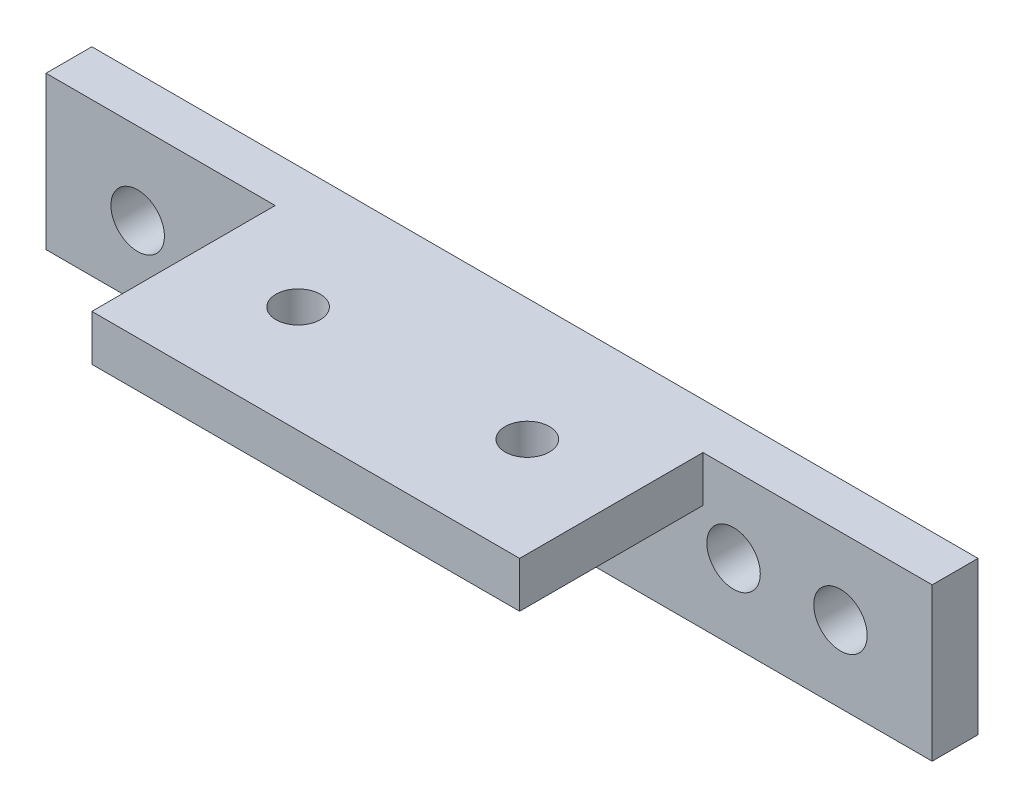
ISO-10303-21;
HEADER;
FILE_DESCRIPTION(('STEP AP214'),'2;1');
FILE_NAME('part.step','',(''),(''),'','','');
FILE_SCHEMA(('AUTOMOTIVE_DESIGN { 1 0 10303 214 1 1 1 1 }'));
ENDSEC;
DATA;
#1=APPLICATION_CONTEXT('core data for automotive mechanical design processes');
#2=APPLICATION_PROTOCOL_DEFINITION('international standard','automotive_design',2000,#1);
#3=PRODUCT_CONTEXT('',#1,'mechanical');
#4=PRODUCT('Part','Part','',(#3));
#5=PRODUCT_RELATED_PRODUCT_CATEGORY('part','',(#4));
#6=PRODUCT_DEFINITION_FORMATION('','',#4);
#7=PRODUCT_DEFINITION_CONTEXT('part definition',#1,'design');
#8=PRODUCT_DEFINITION('design','',#6,#7);
#9=PRODUCT_DEFINITION_SHAPE('','',#8);
#10=(LENGTH_UNIT() NAMED_UNIT(*) SI_UNIT(.MILLI.,.METRE.));
#11=(NAMED_UNIT(*) PLANE_ANGLE_UNIT() SI_UNIT($,.RADIAN.));
#12=(NAMED_UNIT(*) SI_UNIT($,.STERADIAN.) SOLID_ANGLE_UNIT());
#13=UNCERTAINTY_MEASURE_WITH_UNIT(LENGTH_MEASURE(1.E-05),#10,'distance_accuracy_value','');
#14=(GEOMETRIC_REPRESENTATION_CONTEXT(3) GLOBAL_UNCERTAINTY_ASSIGNED_CONTEXT((#13)) GLOBAL_UNIT_ASSIGNED_CONTEXT((#10,
#11,#12)) REPRESENTATION_CONTEXT('',''));
#15=CARTESIAN_POINT('',(0.,0.,0.));
#16=DIRECTION('',(0.,0.,1.));
#17=DIRECTION('',(1.,0.,0.));
#18=AXIS2_PLACEMENT_3D('',#15,#16,#17);
#19=CARTESIAN_POINT('',(0.,3.,0.));
#20=DIRECTION('',(0.,1.,0.));
#21=DIRECTION('',(0.,0.,1.));
#22=AXIS2_PLACEMENT_3D('',#19,#20,#21);
#23=PLANE('',#22);
#24=CARTESIAN_POINT('',(6.5,3.,5.));
#25=DIRECTION('',(0.,1.,0.));
#26=DIRECTION('',(0.,0.,1.));
#27=AXIS2_PLACEMENT_3D('',#24,#25,#26);
#28=CIRCLE('',#27,1.45);
#29=CARTESIAN_POINT('',(6.5,3.,6.45));
#30=VERTEX_POINT('',#29);
#31=EDGE_CURVE('E157',#30,#30,#28,.T.);
#32=ORIENTED_EDGE('',*,*,#31,.F.);
#33=EDGE_LOOP('',(#32));
#34=FACE_BOUND('',#33,.T.);
#35=DIRECTION('',(0.,0.,1.));
#36=VECTOR('',#35,1.);
#37=CARTESIAN_POINT('',(0.,3.,0.));
#38=LINE('',#37,#36);
#39=CARTESIAN_POINT('',(0.,3.,0.));
#40=VERTEX_POINT('',#39);
#41=CARTESIAN_POINT('',(0.,3.,12.));
#42=VERTEX_POINT('',#41);
#43=EDGE_CURVE('E50',#40,#42,#38,.T.);
#44=ORIENTED_EDGE('',*,*,#43,.T.);
#45=DIRECTION('',(1.,0.,0.));
#46=VECTOR('',#45,1.);
#47=CARTESIAN_POINT('',(0.,3.,12.));
#48=LINE('',#47,#46);
#49=CARTESIAN_POINT('',(28.,3.,12.));
#50=VERTEX_POINT('',#49);
#51=EDGE_CURVE('E73',#42,#50,#48,.T.);
#52=ORIENTED_EDGE('',*,*,#51,.T.);
#53=DIRECTION('',(0.,0.,-1.));
#54=VECTOR('',#53,1.);
#55=CARTESIAN_POINT('',(28.,3.,0.));
#56=LINE('',#55,#54);
#57=CARTESIAN_POINT('',(28.,3.,0.));
#58=VERTEX_POINT('',#57);
#59=EDGE_CURVE('E166',#50,#58,#56,.T.);
#60=ORIENTED_EDGE('',*,*,#59,.T.);
#61=DIRECTION('',(1.,0.,0.));
#62=VECTOR('',#61,1.);
#63=CARTESIAN_POINT('',(43.,3.,0.));
#64=LINE('',#63,#62);
#65=CARTESIAN_POINT('',(43.,3.,0.));
#66=VERTEX_POINT('',#65);
#67=EDGE_CURVE('E132',#58,#66,#64,.T.);
#68=ORIENTED_EDGE('',*,*,#67,.T.);
#69=DIRECTION('',(0.,0.,-1.));
#70=VECTOR('',#69,1.);
#71=CARTESIAN_POINT('',(43.,3.,0.));
#72=LINE('',#71,#70);
#73=CARTESIAN_POINT('',(43.,3.,-3.00000000000001));
#74=VERTEX_POINT('',#73);
#75=EDGE_CURVE('E140',#66,#74,#72,.T.);
#76=ORIENTED_EDGE('',*,*,#75,.T.);
#77=DIRECTION('',(-1.,0.,0.));
#78=VECTOR('',#77,1.);
#79=CARTESIAN_POINT('',(43.,3.,-3.00000000000001));
#80=LINE('',#79,#78);
#81=CARTESIAN_POINT('',(-15.,3.,-3.));
#82=VERTEX_POINT('',#81);
#83=EDGE_CURVE('E108',#74,#82,#80,.T.);
#84=ORIENTED_EDGE('',*,*,#83,.T.);
#85=DIRECTION('',(0.,0.,1.));
#86=VECTOR('',#85,1.);
#87=CARTESIAN_POINT('',(-15.,3.,0.));
#88=LINE('',#87,#86);
#89=CARTESIAN_POINT('',(-15.,3.,0.));
#90=VERTEX_POINT('',#89);
#91=EDGE_CURVE('E143',#82,#90,#88,.T.);
#92=ORIENTED_EDGE('',*,*,#91,.T.);
#93=EDGE_CURVE('E129',#90,#40,#64,.T.);
#94=ORIENTED_EDGE('',*,*,#93,.T.);
#95=EDGE_LOOP('',(#44,#52,#60,#68,#76,#84,#92,#94));
#96=FACE_BOUND('',#95,.T.);
#97=CARTESIAN_POINT('',(21.5,3.,5.));
#98=DIRECTION('',(0.,1.,0.));
#99=DIRECTION('',(0.,0.,1.));
#100=AXIS2_PLACEMENT_3D('',#97,#98,#99);
#101=CIRCLE('',#100,1.45);
#102=CARTESIAN_POINT('',(21.5,3.,6.45));
#103=VERTEX_POINT('',#102);
#104=EDGE_CURVE('E151',#103,#103,#101,.T.);
#105=ORIENTED_EDGE('',*,*,#104,.F.);
#106=EDGE_LOOP('',(#105));
#107=FACE_BOUND('',#106,.T.);
#108=ADVANCED_FACE('F33',(#34,#96,#107),#23,.T.);
#109=CARTESIAN_POINT('',(0.,0.,0.));
#110=DIRECTION('',(0.,1.,0.));
#111=DIRECTION('',(0.,0.,1.));
#112=AXIS2_PLACEMENT_3D('',#109,#110,#111);
#113=PLANE('',#112);
#114=DIRECTION('',(0.,0.,1.));
#115=VECTOR('',#114,1.);
#116=CARTESIAN_POINT('',(0.,0.,0.));
#117=LINE('',#116,#115);
#118=CARTESIAN_POINT('',(0.,0.,0.));
#119=VERTEX_POINT('',#118);
#120=CARTESIAN_POINT('',(0.,0.,12.));
#121=VERTEX_POINT('',#120);
#122=EDGE_CURVE('E160',#119,#121,#117,.T.);
#123=ORIENTED_EDGE('',*,*,#122,.F.);
#124=DIRECTION('',(-1.,0.,0.));
#125=VECTOR('',#124,1.);
#126=CARTESIAN_POINT('',(0.,0.,0.));
#127=LINE('',#126,#125);
#128=CARTESIAN_POINT('',(28.,0.,0.));
#129=VERTEX_POINT('',#128);
#130=EDGE_CURVE('E164',#129,#119,#127,.T.);
#131=ORIENTED_EDGE('',*,*,#130,.F.);
#132=DIRECTION('',(0.,0.,-1.));
#133=VECTOR('',#132,1.);
#134=CARTESIAN_POINT('',(28.,0.,0.));
#135=LINE('',#134,#133);
#136=CARTESIAN_POINT('',(28.,0.,12.));
#137=VERTEX_POINT('',#136);
#138=EDGE_CURVE('E170',#137,#129,#135,.T.);
#139=ORIENTED_EDGE('',*,*,#138,.F.);
#140=DIRECTION('',(1.,0.,0.));
#141=VECTOR('',#140,1.);
#142=CARTESIAN_POINT('',(0.,0.,12.));
#143=LINE('',#142,#141);
#144=EDGE_CURVE('E64',#121,#137,#143,.T.);
#145=ORIENTED_EDGE('',*,*,#144,.F.);
#146=EDGE_LOOP('',(#123,#131,#139,#145));
#147=FACE_BOUND('',#146,.T.);
#148=CARTESIAN_POINT('',(6.5,0.,5.));
#149=DIRECTION('',(0.,1.,0.));
#150=DIRECTION('',(0.,0.,1.));
#151=AXIS2_PLACEMENT_3D('',#148,#149,#150);
#152=CIRCLE('',#151,1.45);
#153=CARTESIAN_POINT('',(6.5,0.,6.45));
#154=VERTEX_POINT('',#153);
#155=EDGE_CURVE('E154',#154,#154,#152,.T.);
#156=ORIENTED_EDGE('',*,*,#155,.T.);
#157=EDGE_LOOP('',(#156));
#158=FACE_BOUND('',#157,.T.);
#159=CARTESIAN_POINT('',(21.5,0.,5.));
#160=DIRECTION('',(0.,1.,0.));
#161=DIRECTION('',(0.,0.,1.));
#162=AXIS2_PLACEMENT_3D('',#159,#160,#161);
#163=CIRCLE('',#162,1.45);
#164=CARTESIAN_POINT('',(21.5,0.,6.45));
#165=VERTEX_POINT('',#164);
#166=EDGE_CURVE('E147',#165,#165,#163,.T.);
#167=ORIENTED_EDGE('',*,*,#166,.T.);
#168=EDGE_LOOP('',(#167));
#169=FACE_BOUND('',#168,.T.);
#170=ADVANCED_FACE('F184',(#147,#158,#169),#113,.F.);
#171=CARTESIAN_POINT('',(0.,3.,0.));
#172=DIRECTION('',(1.,0.,0.));
#173=DIRECTION('',(0.,0.,-1.));
#174=AXIS2_PLACEMENT_3D('',#171,#172,#173);
#175=PLANE('',#174);
#176=ORIENTED_EDGE('',*,*,#122,.T.);
#177=DIRECTION('',(0.,-1.,0.));
#178=VECTOR('',#177,1.);
#179=CARTESIAN_POINT('',(0.,3.,12.));
#180=LINE('',#179,#178);
#181=EDGE_CURVE('E11',#42,#121,#180,.T.);
#182=ORIENTED_EDGE('',*,*,#181,.F.);
#183=ORIENTED_EDGE('',*,*,#43,.F.);
#184=DIRECTION('',(0.,-1.,0.));
#185=VECTOR('',#184,1.);
#186=CARTESIAN_POINT('',(0.,3.,0.));
#187=LINE('',#186,#185);
#188=EDGE_CURVE('E68',#40,#119,#187,.T.);
#189=ORIENTED_EDGE('',*,*,#188,.T.);
#190=EDGE_LOOP('',(#176,#182,#183,#189));
#191=FACE_BOUND('',#190,.T.);
#192=ADVANCED_FACE('F35',(#191),#175,.F.);
#193=CARTESIAN_POINT('',(0.,3.,12.));
#194=DIRECTION('',(0.,0.,-1.));
#195=DIRECTION('',(-1.,0.,0.));
#196=AXIS2_PLACEMENT_3D('',#193,#194,#195);
#197=PLANE('',#196);
#198=ORIENTED_EDGE('',*,*,#144,.T.);
#199=DIRECTION('',(0.,-1.,0.));
#200=VECTOR('',#199,1.);
#201=CARTESIAN_POINT('',(28.,3.,12.));
#202=LINE('',#201,#200);
#203=EDGE_CURVE('E42',#50,#137,#202,.T.);
#204=ORIENTED_EDGE('',*,*,#203,.F.);
#205=ORIENTED_EDGE('',*,*,#51,.F.);
#206=ORIENTED_EDGE('',*,*,#181,.T.);
#207=EDGE_LOOP('',(#198,#204,#205,#206));
#208=FACE_BOUND('',#207,.T.);
#209=ADVANCED_FACE('F192',(#208),#197,.F.);
#210=CARTESIAN_POINT('',(28.,3.,0.));
#211=DIRECTION('',(-1.,0.,0.));
#212=DIRECTION('',(0.,0.,1.));
#213=AXIS2_PLACEMENT_3D('',#210,#211,#212);
#214=PLANE('',#213);
#215=ORIENTED_EDGE('',*,*,#138,.T.);
#216=DIRECTION('',(0.,-1.,0.));
#217=VECTOR('',#216,1.);
#218=CARTESIAN_POINT('',(28.,3.,0.));
#219=LINE('',#218,#217);
#220=EDGE_CURVE('E176',#58,#129,#219,.T.);
#221=ORIENTED_EDGE('',*,*,#220,.F.);
#222=ORIENTED_EDGE('',*,*,#59,.F.);
#223=ORIENTED_EDGE('',*,*,#203,.T.);
#224=EDGE_LOOP('',(#215,#221,#222,#223));
#225=FACE_BOUND('',#224,.T.);
#226=ADVANCED_FACE('F181',(#225),#214,.F.);
#227=CARTESIAN_POINT('',(6.5,3.,5.));
#228=DIRECTION('',(0.,-1.,0.));
#229=DIRECTION('',(0.,0.,-1.));
#230=AXIS2_PLACEMENT_3D('',#227,#228,#229);
#231=CYLINDRICAL_SURFACE('',#230,1.45);
#232=ORIENTED_EDGE('',*,*,#31,.T.);
#233=EDGE_LOOP('',(#232));
#234=FACE_BOUND('',#233,.T.);
#235=ORIENTED_EDGE('',*,*,#155,.F.);
#236=EDGE_LOOP('',(#235));
#237=FACE_BOUND('',#236,.T.);
#238=ADVANCED_FACE('F198',(#234,#237),#231,.F.);
#239=CARTESIAN_POINT('',(21.5,3.,5.));
#240=DIRECTION('',(0.,-1.,0.));
#241=DIRECTION('',(0.,0.,-1.));
#242=AXIS2_PLACEMENT_3D('',#239,#240,#241);
#243=CYLINDRICAL_SURFACE('',#242,1.45);
#244=ORIENTED_EDGE('',*,*,#104,.T.);
#245=EDGE_LOOP('',(#244));
#246=FACE_BOUND('',#245,.T.);
#247=ORIENTED_EDGE('',*,*,#166,.F.);
#248=EDGE_LOOP('',(#247));
#249=FACE_BOUND('',#248,.T.);
#250=ADVANCED_FACE('F211',(#246,#249),#243,.F.);
#251=CARTESIAN_POINT('',(43.,-7.,0.));
#252=DIRECTION('',(0.,0.,1.));
#253=DIRECTION('',(1.,0.,0.));
#254=AXIS2_PLACEMENT_3D('',#251,#252,#253);
#255=PLANE('',#254);
#256=CARTESIAN_POINT('',(36.9985952954715,-2.,0.));
#257=DIRECTION('',(0.,0.,1.));
#258=DIRECTION('',(1.,0.,0.));
#259=AXIS2_PLACEMENT_3D('',#256,#257,#258);
#260=CIRCLE('',#259,1.75);
#261=CARTESIAN_POINT('',(38.7485952954715,-2.,0.));
#262=VERTEX_POINT('',#261);
#263=EDGE_CURVE('E250',#262,#262,#260,.T.);
#264=ORIENTED_EDGE('',*,*,#263,.F.);
#265=EDGE_LOOP('',(#264));
#266=FACE_BOUND('',#265,.T.);
#267=CARTESIAN_POINT('',(-1.99999999999999,-2.,0.));
#268=DIRECTION('',(0.,0.,1.));
#269=DIRECTION('',(1.,0.,0.));
#270=AXIS2_PLACEMENT_3D('',#267,#268,#269);
#271=CIRCLE('',#270,1.75);
#272=CARTESIAN_POINT('',(-0.249999999999995,-2.,0.));
#273=VERTEX_POINT('',#272);
#274=EDGE_CURVE('E258',#273,#273,#271,.T.);
#275=ORIENTED_EDGE('',*,*,#274,.F.);
#276=EDGE_LOOP('',(#275));
#277=FACE_BOUND('',#276,.T.);
#278=CARTESIAN_POINT('',(30.,-2.,0.));
#279=DIRECTION('',(0.,0.,1.));
#280=DIRECTION('',(1.,0.,0.));
#281=AXIS2_PLACEMENT_3D('',#278,#279,#280);
#282=CIRCLE('',#281,1.75);
#283=CARTESIAN_POINT('',(31.75,-2.,0.));
#284=VERTEX_POINT('',#283);
#285=EDGE_CURVE('E254',#284,#284,#282,.T.);
#286=ORIENTED_EDGE('',*,*,#285,.F.);
#287=EDGE_LOOP('',(#286));
#288=FACE_BOUND('',#287,.T.);
#289=CARTESIAN_POINT('',(-9.,-2.35948691690169,0.));
#290=DIRECTION('',(0.,0.,1.));
#291=DIRECTION('',(1.,0.,0.));
#292=AXIS2_PLACEMENT_3D('',#289,#290,#291);
#293=CIRCLE('',#292,1.75);
#294=CARTESIAN_POINT('',(-7.25,-2.35948691690169,0.));
#295=VERTEX_POINT('',#294);
#296=EDGE_CURVE('E135',#295,#295,#293,.T.);
#297=ORIENTED_EDGE('',*,*,#296,.F.);
#298=EDGE_LOOP('',(#297));
#299=FACE_BOUND('',#298,.T.);
#300=ORIENTED_EDGE('',*,*,#188,.F.);
#301=ORIENTED_EDGE('',*,*,#93,.F.);
#302=DIRECTION('',(0.,1.,0.));
#303=VECTOR('',#302,1.);
#304=CARTESIAN_POINT('',(-15.,-7.,0.));
#305=LINE('',#304,#303);
#306=CARTESIAN_POINT('',(-15.,-7.,0.));
#307=VERTEX_POINT('',#306);
#308=EDGE_CURVE('E148',#307,#90,#305,.T.);
#309=ORIENTED_EDGE('',*,*,#308,.F.);
#310=DIRECTION('',(1.,0.,0.));
#311=VECTOR('',#310,1.);
#312=CARTESIAN_POINT('',(43.,-7.,0.));
#313=LINE('',#312,#311);
#314=CARTESIAN_POINT('',(43.,-7.,0.));
#315=VERTEX_POINT('',#314);
#316=EDGE_CURVE('E114',#307,#315,#313,.T.);
#317=ORIENTED_EDGE('',*,*,#316,.T.);
#318=DIRECTION('',(0.,1.,0.));
#319=VECTOR('',#318,1.);
#320=CARTESIAN_POINT('',(43.,-7.,0.));
#321=LINE('',#320,#319);
#322=EDGE_CURVE('E128',#315,#66,#321,.T.);
#323=ORIENTED_EDGE('',*,*,#322,.T.);
#324=ORIENTED_EDGE('',*,*,#67,.F.);
#325=ORIENTED_EDGE('',*,*,#220,.T.);
#326=ORIENTED_EDGE('',*,*,#130,.T.);
#327=EDGE_LOOP('',(#300,#301,#309,#317,#323,#324,#325,#326));
#328=FACE_BOUND('',#327,.T.);
#329=ADVANCED_FACE('F187',(#266,#277,#288,#299,#328),#255,.T.);
#330=CARTESIAN_POINT('',(43.,-7.,0.));
#331=DIRECTION('',(1.,0.,0.));
#332=DIRECTION('',(0.,0.,-1.));
#333=AXIS2_PLACEMENT_3D('',#330,#331,#332);
#334=PLANE('',#333);
#335=ORIENTED_EDGE('',*,*,#75,.F.);
#336=ORIENTED_EDGE('',*,*,#322,.F.);
#337=DIRECTION('',(0.,0.,-1.));
#338=VECTOR('',#337,1.);
#339=CARTESIAN_POINT('',(43.,-7.,0.));
#340=LINE('',#339,#338);
#341=CARTESIAN_POINT('',(43.,-7.,-3.00000000000001));
#342=VERTEX_POINT('',#341);
#343=EDGE_CURVE('E121',#315,#342,#340,.T.);
#344=ORIENTED_EDGE('',*,*,#343,.T.);
#345=DIRECTION('',(0.,1.,0.));
#346=VECTOR('',#345,1.);
#347=CARTESIAN_POINT('',(43.,-7.,-3.00000000000001));
#348=LINE('',#347,#346);
#349=EDGE_CURVE('E103',#342,#74,#348,.T.);
#350=ORIENTED_EDGE('',*,*,#349,.T.);
#351=EDGE_LOOP('',(#335,#336,#344,#350));
#352=FACE_BOUND('',#351,.T.);
#353=ADVANCED_FACE('F126',(#352),#334,.T.);
#354=CARTESIAN_POINT('',(-15.,-7.,0.));
#355=DIRECTION('',(-1.,0.,0.));
#356=DIRECTION('',(0.,0.,1.));
#357=AXIS2_PLACEMENT_3D('',#354,#355,#356);
#358=PLANE('',#357);
#359=ORIENTED_EDGE('',*,*,#91,.F.);
#360=DIRECTION('',(0.,1.,0.));
#361=VECTOR('',#360,1.);
#362=CARTESIAN_POINT('',(-15.,-7.,-3.));
#363=LINE('',#362,#361);
#364=CARTESIAN_POINT('',(-15.,-7.,-3.));
#365=VERTEX_POINT('',#364);
#366=EDGE_CURVE('E113',#365,#82,#363,.T.);
#367=ORIENTED_EDGE('',*,*,#366,.F.);
#368=DIRECTION('',(0.,0.,1.));
#369=VECTOR('',#368,1.);
#370=CARTESIAN_POINT('',(-15.,-7.,0.));
#371=LINE('',#370,#369);
#372=EDGE_CURVE('E124',#365,#307,#371,.T.);
#373=ORIENTED_EDGE('',*,*,#372,.T.);
#374=ORIENTED_EDGE('',*,*,#308,.T.);
#375=EDGE_LOOP('',(#359,#367,#373,#374));
#376=FACE_BOUND('',#375,.T.);
#377=ADVANCED_FACE('F218',(#376),#358,.T.);
#378=CARTESIAN_POINT('',(43.,-7.,-3.00000000000001));
#379=DIRECTION('',(0.,0.,-1.));
#380=DIRECTION('',(-1.,0.,0.));
#381=AXIS2_PLACEMENT_3D('',#378,#379,#380);
#382=PLANE('',#381);
#383=CARTESIAN_POINT('',(36.9985952954715,-2.,-3.00000000000001));
#384=DIRECTION('',(0.,0.,-1.));
#385=DIRECTION('',(-1.,0.,0.));
#386=AXIS2_PLACEMENT_3D('',#383,#384,#385);
#387=CIRCLE('',#386,1.75);
#388=CARTESIAN_POINT('',(35.2485952954715,-2.,-3.00000000000001));
#389=VERTEX_POINT('',#388);
#390=EDGE_CURVE('E253',#389,#389,#387,.T.);
#391=ORIENTED_EDGE('',*,*,#390,.F.);
#392=EDGE_LOOP('',(#391));
#393=FACE_BOUND('',#392,.T.);
#394=CARTESIAN_POINT('',(-2.,-2.,-3.));
#395=DIRECTION('',(0.,0.,-1.));
#396=DIRECTION('',(-1.,0.,0.));
#397=AXIS2_PLACEMENT_3D('',#394,#395,#396);
#398=CIRCLE('',#397,1.75);
#399=CARTESIAN_POINT('',(-3.75,-2.,-3.));
#400=VERTEX_POINT('',#399);
#401=EDGE_CURVE('E255',#400,#400,#398,.T.);
#402=ORIENTED_EDGE('',*,*,#401,.F.);
#403=EDGE_LOOP('',(#402));
#404=FACE_BOUND('',#403,.T.);
#405=CARTESIAN_POINT('',(30.,-2.,-3.));
#406=DIRECTION('',(0.,0.,-1.));
#407=DIRECTION('',(-1.,0.,0.));
#408=AXIS2_PLACEMENT_3D('',#405,#406,#407);
#409=CIRCLE('',#408,1.75);
#410=CARTESIAN_POINT('',(28.25,-2.,-3.));
#411=VERTEX_POINT('',#410);
#412=EDGE_CURVE('E261',#411,#411,#409,.T.);
#413=ORIENTED_EDGE('',*,*,#412,.F.);
#414=EDGE_LOOP('',(#413));
#415=FACE_BOUND('',#414,.T.);
#416=CARTESIAN_POINT('',(-9.,-2.35948691690169,-3.));
#417=DIRECTION('',(0.,0.,-1.));
#418=DIRECTION('',(-1.,0.,0.));
#419=AXIS2_PLACEMENT_3D('',#416,#417,#418);
#420=CIRCLE('',#419,1.75);
#421=CARTESIAN_POINT('',(-10.75,-2.35948691690169,-3.));
#422=VERTEX_POINT('',#421);
#423=EDGE_CURVE('E268',#422,#422,#420,.T.);
#424=ORIENTED_EDGE('',*,*,#423,.F.);
#425=EDGE_LOOP('',(#424));
#426=FACE_BOUND('',#425,.T.);
#427=ORIENTED_EDGE('',*,*,#83,.F.);
#428=ORIENTED_EDGE('',*,*,#349,.F.);
#429=DIRECTION('',(-1.,0.,0.));
#430=VECTOR('',#429,1.);
#431=CARTESIAN_POINT('',(43.,-7.,-3.00000000000001));
#432=LINE('',#431,#430);
#433=EDGE_CURVE('E106',#342,#365,#432,.T.);
#434=ORIENTED_EDGE('',*,*,#433,.T.);
#435=ORIENTED_EDGE('',*,*,#366,.T.);
#436=EDGE_LOOP('',(#427,#428,#434,#435));
#437=FACE_BOUND('',#436,.T.);
#438=ADVANCED_FACE('F105',(#393,#404,#415,#426,#437),#382,.T.);
#439=CARTESIAN_POINT('',(0.,-7.,0.));
#440=DIRECTION('',(0.,1.,0.));
#441=DIRECTION('',(0.,0.,1.));
#442=AXIS2_PLACEMENT_3D('',#439,#440,#441);
#443=PLANE('',#442);
#444=ORIENTED_EDGE('',*,*,#343,.F.);
#445=ORIENTED_EDGE('',*,*,#316,.F.);
#446=ORIENTED_EDGE('',*,*,#372,.F.);
#447=ORIENTED_EDGE('',*,*,#433,.F.);
#448=EDGE_LOOP('',(#444,#445,#446,#447));
#449=FACE_BOUND('',#448,.T.);
#450=ADVANCED_FACE('F119',(#449),#443,.F.);
#451=CARTESIAN_POINT('',(-9.,-2.35948691690169,9.));
#452=DIRECTION('',(0.,0.,-1.));
#453=DIRECTION('',(-1.,0.,0.));
#454=AXIS2_PLACEMENT_3D('',#451,#452,#453);
#455=CYLINDRICAL_SURFACE('',#454,1.75);
#456=ORIENTED_EDGE('',*,*,#296,.T.);
#457=EDGE_LOOP('',(#456));
#458=FACE_BOUND('',#457,.T.);
#459=ORIENTED_EDGE('',*,*,#423,.T.);
#460=EDGE_LOOP('',(#459));
#461=FACE_BOUND('',#460,.T.);
#462=ADVANCED_FACE('F230',(#458,#461),#455,.F.);
#463=CARTESIAN_POINT('',(30.,-2.,9.));
#464=DIRECTION('',(0.,0.,-1.));
#465=DIRECTION('',(-1.,0.,0.));
#466=AXIS2_PLACEMENT_3D('',#463,#464,#465);
#467=CYLINDRICAL_SURFACE('',#466,1.75);
#468=ORIENTED_EDGE('',*,*,#285,.T.);
#469=EDGE_LOOP('',(#468));
#470=FACE_BOUND('',#469,.T.);
#471=ORIENTED_EDGE('',*,*,#412,.T.);
#472=EDGE_LOOP('',(#471));
#473=FACE_BOUND('',#472,.T.);
#474=ADVANCED_FACE('F233',(#470,#473),#467,.F.);
#475=CARTESIAN_POINT('',(-1.99999999999999,-2.,9.));
#476=DIRECTION('',(0.,0.,-1.));
#477=DIRECTION('',(-1.,0.,0.));
#478=AXIS2_PLACEMENT_3D('',#475,#476,#477);
#479=CYLINDRICAL_SURFACE('',#478,1.75);
#480=ORIENTED_EDGE('',*,*,#274,.T.);
#481=EDGE_LOOP('',(#480));
#482=FACE_BOUND('',#481,.T.);
#483=ORIENTED_EDGE('',*,*,#401,.T.);
#484=EDGE_LOOP('',(#483));
#485=FACE_BOUND('',#484,.T.);
#486=ADVANCED_FACE('F237',(#482,#485),#479,.F.);
#487=CARTESIAN_POINT('',(36.9985952954715,-2.,8.99999999999999));
#488=DIRECTION('',(0.,0.,-1.));
#489=DIRECTION('',(-1.,0.,0.));
#490=AXIS2_PLACEMENT_3D('',#487,#488,#489);
#491=CYLINDRICAL_SURFACE('',#490,1.75);
#492=ORIENTED_EDGE('',*,*,#263,.T.);
#493=EDGE_LOOP('',(#492));
#494=FACE_BOUND('',#493,.T.);
#495=ORIENTED_EDGE('',*,*,#390,.T.);
#496=EDGE_LOOP('',(#495));
#497=FACE_BOUND('',#496,.T.);
#498=ADVANCED_FACE('F241',(#494,#497),#491,.F.);
#499=CLOSED_SHELL('',(#108,#170,#192,#209,#226,#238,#250,#329,#353,#377,#438,#450,#462,#474,
#486,#498));
#500=MANIFOLD_SOLID_BREP('B2',#499);
#501=ADVANCED_BREP_SHAPE_REPRESENTATION('',(#18,#500),#14);
#502=SHAPE_DEFINITION_REPRESENTATION(#9,#501);
ENDSEC;
END-ISO-10303-21;
